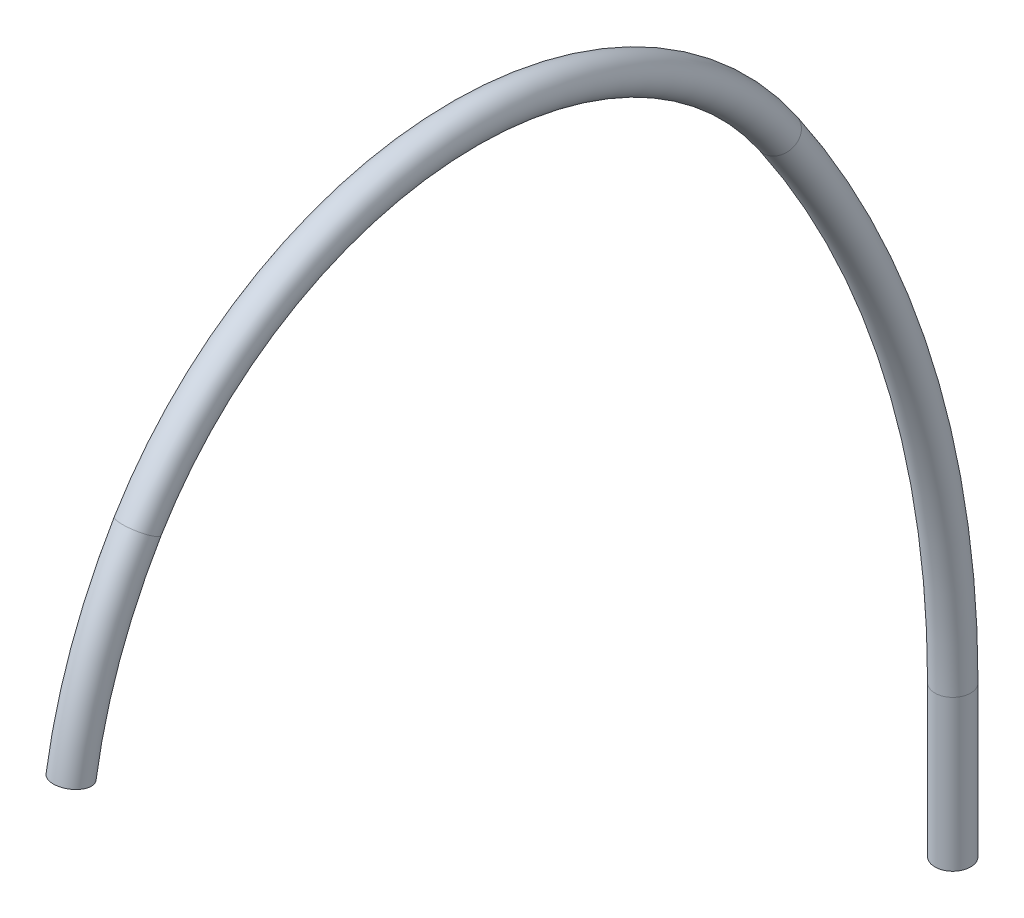
ISO-10303-21;
HEADER;
FILE_DESCRIPTION(('STEP AP214'),'2;1');
FILE_NAME('part.step','',(''),(''),'','','');
FILE_SCHEMA(('AUTOMOTIVE_DESIGN { 1 0 10303 214 1 1 1 1 }'));
ENDSEC;
DATA;
#1=APPLICATION_CONTEXT('core data for automotive mechanical design processes');
#2=APPLICATION_PROTOCOL_DEFINITION('international standard','automotive_design',2000,#1);
#3=PRODUCT_CONTEXT('',#1,'mechanical');
#4=PRODUCT('Part','Part','',(#3));
#5=PRODUCT_RELATED_PRODUCT_CATEGORY('part','',(#4));
#6=PRODUCT_DEFINITION_FORMATION('','',#4);
#7=PRODUCT_DEFINITION_CONTEXT('part definition',#1,'design');
#8=PRODUCT_DEFINITION('design','',#6,#7);
#9=PRODUCT_DEFINITION_SHAPE('','',#8);
#10=(LENGTH_UNIT() NAMED_UNIT(*) SI_UNIT(.MILLI.,.METRE.));
#11=(NAMED_UNIT(*) PLANE_ANGLE_UNIT() SI_UNIT($,.RADIAN.));
#12=(NAMED_UNIT(*) SI_UNIT($,.STERADIAN.) SOLID_ANGLE_UNIT());
#13=UNCERTAINTY_MEASURE_WITH_UNIT(LENGTH_MEASURE(1.E-05),#10,'distance_accuracy_value','');
#14=(GEOMETRIC_REPRESENTATION_CONTEXT(3) GLOBAL_UNCERTAINTY_ASSIGNED_CONTEXT((#13)) GLOBAL_UNIT_ASSIGNED_CONTEXT((#10,
#11,#12)) REPRESENTATION_CONTEXT('',''));
#15=CARTESIAN_POINT('',(0.,0.,0.));
#16=DIRECTION('',(0.,0.,1.));
#17=DIRECTION('',(1.,0.,0.));
#18=AXIS2_PLACEMENT_3D('',#15,#16,#17);
#19=CARTESIAN_POINT('',(0.,160.614265839188,117.12690278007));
#20=DIRECTION('',(1.,0.,0.));
#21=DIRECTION('',(0.,0.,-1.));
#22=AXIS2_PLACEMENT_3D('',#19,#20,#21);
#23=TOROIDAL_SURFACE('',#22,143.708020588454,5.);
#24=CARTESIAN_POINT('',(0.,234.429806703849,240.428407670761));
#25=DIRECTION('',(0.,-0.858000161617963,0.51364941610358));
#26=DIRECTION('',(0.,-0.51364941610358,-0.858000161617963));
#27=AXIS2_PLACEMENT_3D('',#24,#25,#26);
#28=CIRCLE('',#27,5.);
#29=CARTESIAN_POINT('',(0.,236.998053784367,244.718408478851));
#30=VERTEX_POINT('',#29);
#31=EDGE_CURVE('E37',#30,#30,#28,.T.);
#32=CARTESIAN_POINT('',(0.,182.868001968919,259.101430107052));
#33=DIRECTION('',(0.,-0.987937393790729,0.154853821231454));
#34=DIRECTION('',(0.,-0.154853821231454,-0.987937393790729));
#35=AXIS2_PLACEMENT_3D('',#32,#33,#34);
#36=CIRCLE('',#35,5.);
#37=CARTESIAN_POINT('',(0.,183.642271075076,264.041117076005));
#38=VERTEX_POINT('',#37);
#39=EDGE_CURVE('E10',#38,#38,#36,.T.);
#40=CARTESIAN_POINT('',(0.,160.614265839188,117.12690278007));
#41=DIRECTION('',(1.,0.,0.));
#42=DIRECTION('',(0.,0.,-1.));
#43=AXIS2_PLACEMENT_3D('',#40,#41,#42);
#44=CIRCLE('',#43,148.708020588454);
#45=EDGE_CURVE('',#30,#38,#44,.T.);
#46=ORIENTED_EDGE('',*,*,#31,.T.);
#47=ORIENTED_EDGE('',*,*,#39,.F.);
#48=ORIENTED_EDGE('',*,*,#45,.T.);
#49=ORIENTED_EDGE('',*,*,#45,.F.);
#50=EDGE_LOOP('',(#46,#48,#47,#49));
#51=FACE_BOUND('',#50,.T.);
#52=ADVANCED_FACE('F31',(#51),#23,.T.);
#53=CARTESIAN_POINT('',(0.,179.627389442073,148.886430996582));
#54=DIRECTION('',(1.,0.,0.));
#55=DIRECTION('',(0.,0.,-1.));
#56=AXIS2_PLACEMENT_3D('',#53,#54,#55);
#57=TOROIDAL_SURFACE('',#56,106.692260408849,5.);
#58=CARTESIAN_POINT('',(0.,239.966049995903,60.8950423626975));
#59=DIRECTION('',(0.,0.824721383694545,0.565539246451522));
#60=DIRECTION('',(0.,-0.565539246451522,0.824721383694545));
#61=AXIS2_PLACEMENT_3D('',#58,#59,#60);
#62=CIRCLE('',#61,5.);
#63=CARTESIAN_POINT('',(0.,242.79374622816,56.7714354442248));
#64=VERTEX_POINT('',#63);
#65=EDGE_CURVE('E41',#64,#64,#62,.T.);
#66=CARTESIAN_POINT('',(0.,179.627389442073,148.886430996582));
#67=DIRECTION('',(1.,0.,0.));
#68=DIRECTION('',(0.,0.,-1.));
#69=AXIS2_PLACEMENT_3D('',#66,#67,#68);
#70=CIRCLE('',#69,111.692260408849);
#71=EDGE_CURVE('',#64,#30,#70,.T.);
#72=ORIENTED_EDGE('',*,*,#65,.T.);
#73=ORIENTED_EDGE('',*,*,#31,.F.);
#74=ORIENTED_EDGE('',*,*,#71,.T.);
#75=ORIENTED_EDGE('',*,*,#71,.F.);
#76=EDGE_LOOP('',(#72,#74,#73,#75));
#77=FACE_BOUND('',#76,.T.);
#78=ADVANCED_FACE('F93',(#77),#57,.T.);
#79=CARTESIAN_POINT('',(0.,82.2054172623216,290.956117941329));
#80=DIRECTION('',(1.,0.,0.));
#81=DIRECTION('',(0.,0.,-1.));
#82=AXIS2_PLACEMENT_3D('',#79,#80,#81);
#83=TOROIDAL_SURFACE('',#82,278.956117941329,5.);
#84=CARTESIAN_POINT('',(0.,82.2054172623216,12.));
#85=DIRECTION('',(0.,1.,0.));
#86=DIRECTION('',(0.,0.,1.));
#87=AXIS2_PLACEMENT_3D('',#84,#85,#86);
#88=CIRCLE('',#87,5.);
#89=CARTESIAN_POINT('',(0.,82.2054172623216,7.00000000000001));
#90=VERTEX_POINT('',#89);
#91=EDGE_CURVE('E45',#90,#90,#88,.T.);
#92=CARTESIAN_POINT('',(0.,82.2054172623216,290.956117941329));
#93=DIRECTION('',(1.,0.,0.));
#94=DIRECTION('',(0.,0.,-1.));
#95=AXIS2_PLACEMENT_3D('',#92,#93,#94);
#96=CIRCLE('',#95,283.956117941329);
#97=EDGE_CURVE('',#90,#64,#96,.T.);
#98=ORIENTED_EDGE('',*,*,#91,.T.);
#99=ORIENTED_EDGE('',*,*,#65,.F.);
#100=ORIENTED_EDGE('',*,*,#97,.T.);
#101=ORIENTED_EDGE('',*,*,#97,.F.);
#102=EDGE_LOOP('',(#98,#100,#99,#101));
#103=FACE_BOUND('',#102,.T.);
#104=ADVANCED_FACE('F88',(#103),#83,.T.);
#105=CARTESIAN_POINT('',(0.,82.2054172623216,12.));
#106=DIRECTION('',(0.,-1.,0.));
#107=DIRECTION('',(0.,0.,-1.));
#108=AXIS2_PLACEMENT_3D('',#105,#106,#107);
#109=CYLINDRICAL_SURFACE('',#108,5.);
#110=ORIENTED_EDGE('',*,*,#91,.F.);
#111=EDGE_LOOP('',(#110));
#112=FACE_BOUND('',#111,.T.);
#113=CARTESIAN_POINT('',(0.,40.,12.));
#114=DIRECTION('',(0.,1.,0.));
#115=DIRECTION('',(0.,0.,1.));
#116=AXIS2_PLACEMENT_3D('',#113,#114,#115);
#117=CIRCLE('',#116,5.);
#118=CARTESIAN_POINT('',(0.,40.,17.));
#119=VERTEX_POINT('',#118);
#120=EDGE_CURVE('E48',#119,#119,#117,.T.);
#121=ORIENTED_EDGE('',*,*,#120,.T.);
#122=EDGE_LOOP('',(#121));
#123=FACE_BOUND('',#122,.T.);
#124=ADVANCED_FACE('F80',(#112,#123),#109,.T.);
#125=CARTESIAN_POINT('',(0.,182.868001968919,259.101430107052));
#126=DIRECTION('',(0.,-0.987937393790729,0.154853821231454));
#127=DIRECTION('',(0.,-0.154853821231454,-0.987937393790729));
#128=AXIS2_PLACEMENT_3D('',#125,#126,#127);
#129=PLANE('',#128);
#130=CARTESIAN_POINT('',(0.,182.868001968918,259.101430107052));
#131=DIRECTION('',(0.,-0.987937393790729,0.154853821231454));
#132=DIRECTION('',(0.,-0.154853821231454,-0.987937393790729));
#133=AXIS2_PLACEMENT_3D('',#130,#131,#132);
#134=CIRCLE('',#133,4.);
#135=CARTESIAN_POINT('',(0.,183.487417253844,263.053179682215));
#136=VERTEX_POINT('',#135);
#137=EDGE_CURVE('E51',#136,#136,#134,.T.);
#138=ORIENTED_EDGE('',*,*,#137,.F.);
#139=EDGE_LOOP('',(#138));
#140=FACE_BOUND('',#139,.T.);
#141=ORIENTED_EDGE('',*,*,#39,.T.);
#142=EDGE_LOOP('',(#141));
#143=FACE_BOUND('',#142,.T.);
#144=ADVANCED_FACE('F78',(#140,#143),#129,.T.);
#145=CARTESIAN_POINT('',(0.,40.,12.));
#146=DIRECTION('',(0.,1.,0.));
#147=DIRECTION('',(0.,0.,1.));
#148=AXIS2_PLACEMENT_3D('',#145,#146,#147);
#149=PLANE('',#148);
#150=CARTESIAN_POINT('',(0.,40.,12.));
#151=DIRECTION('',(0.,1.,0.));
#152=DIRECTION('',(0.,0.,1.));
#153=AXIS2_PLACEMENT_3D('',#150,#151,#152);
#154=CIRCLE('',#153,4.);
#155=CARTESIAN_POINT('',(0.,40.,16.));
#156=VERTEX_POINT('',#155);
#157=EDGE_CURVE('E54',#156,#156,#154,.T.);
#158=ORIENTED_EDGE('',*,*,#157,.T.);
#159=EDGE_LOOP('',(#158));
#160=FACE_BOUND('',#159,.T.);
#161=ORIENTED_EDGE('',*,*,#120,.F.);
#162=EDGE_LOOP('',(#161));
#163=FACE_BOUND('',#162,.T.);
#164=ADVANCED_FACE('F74',(#160,#163),#149,.F.);
#165=CARTESIAN_POINT('',(0.,160.614265839188,117.12690278007));
#166=DIRECTION('',(1.,0.,0.));
#167=DIRECTION('',(0.,0.,-1.));
#168=AXIS2_PLACEMENT_3D('',#165,#166,#167);
#169=TOROIDAL_SURFACE('',#168,143.708020588454,4.);
#170=CARTESIAN_POINT('',(0.,234.429806703849,240.428407670761));
#171=DIRECTION('',(0.,0.858000161617961,-0.513649416103584));
#172=DIRECTION('',(0.,0.513649416103584,0.858000161617961));
#173=AXIS2_PLACEMENT_3D('',#170,#171,#172);
#174=CIRCLE('',#173,4.);
#175=CARTESIAN_POINT('',(0.,236.484404368264,243.860408317233));
#176=VERTEX_POINT('',#175);
#177=EDGE_CURVE('E60',#176,#176,#174,.F.);
#178=CARTESIAN_POINT('',(0.,160.614265839188,117.12690278007));
#179=DIRECTION('',(1.,0.,0.));
#180=DIRECTION('',(0.,0.,-1.));
#181=AXIS2_PLACEMENT_3D('',#178,#179,#180);
#182=CIRCLE('',#181,147.708020588454);
#183=EDGE_CURVE('',#176,#136,#182,.T.);
#184=ORIENTED_EDGE('',*,*,#177,.F.);
#185=ORIENTED_EDGE('',*,*,#137,.T.);
#186=ORIENTED_EDGE('',*,*,#183,.T.);
#187=ORIENTED_EDGE('',*,*,#183,.F.);
#188=EDGE_LOOP('',(#184,#186,#185,#187));
#189=FACE_BOUND('',#188,.T.);
#190=ADVANCED_FACE('F71',(#189),#169,.F.);
#191=CARTESIAN_POINT('',(0.,179.627389442073,148.886430996582));
#192=DIRECTION('',(1.,0.,0.));
#193=DIRECTION('',(0.,0.,-1.));
#194=AXIS2_PLACEMENT_3D('',#191,#192,#193);
#195=TOROIDAL_SURFACE('',#194,106.692260408849,4.);
#196=CARTESIAN_POINT('',(0.,239.966049995903,60.8950423626975));
#197=DIRECTION('',(0.,-0.824721383694545,-0.565539246451522));
#198=DIRECTION('',(0.,0.565539246451522,-0.824721383694545));
#199=AXIS2_PLACEMENT_3D('',#196,#197,#198);
#200=CIRCLE('',#199,4.);
#201=CARTESIAN_POINT('',(0.,242.228206981709,57.5961568279193));
#202=VERTEX_POINT('',#201);
#203=EDGE_CURVE('E63',#202,#202,#200,.F.);
#204=CARTESIAN_POINT('',(0.,179.627389442073,148.886430996582));
#205=DIRECTION('',(1.,0.,0.));
#206=DIRECTION('',(0.,0.,-1.));
#207=AXIS2_PLACEMENT_3D('',#204,#205,#206);
#208=CIRCLE('',#207,110.692260408849);
#209=EDGE_CURVE('',#202,#176,#208,.T.);
#210=ORIENTED_EDGE('',*,*,#203,.F.);
#211=ORIENTED_EDGE('',*,*,#177,.T.);
#212=ORIENTED_EDGE('',*,*,#209,.T.);
#213=ORIENTED_EDGE('',*,*,#209,.F.);
#214=EDGE_LOOP('',(#210,#212,#211,#213));
#215=FACE_BOUND('',#214,.T.);
#216=ADVANCED_FACE('F69',(#215),#195,.F.);
#217=CARTESIAN_POINT('',(0.,82.2054172623216,290.956117941329));
#218=DIRECTION('',(1.,0.,0.));
#219=DIRECTION('',(0.,0.,-1.));
#220=AXIS2_PLACEMENT_3D('',#217,#218,#219);
#221=TOROIDAL_SURFACE('',#220,278.956117941329,4.);
#222=CARTESIAN_POINT('',(0.,82.2054172623216,12.));
#223=DIRECTION('',(0.,-1.,0.));
#224=DIRECTION('',(0.,0.,-1.));
#225=AXIS2_PLACEMENT_3D('',#222,#223,#224);
#226=CIRCLE('',#225,4.);
#227=CARTESIAN_POINT('',(0.,82.2054172623216,8.00000000000001));
#228=VERTEX_POINT('',#227);
#229=EDGE_CURVE('E57',#228,#228,#226,.F.);
#230=CARTESIAN_POINT('',(0.,82.2054172623216,290.956117941329));
#231=DIRECTION('',(1.,0.,0.));
#232=DIRECTION('',(0.,0.,-1.));
#233=AXIS2_PLACEMENT_3D('',#230,#231,#232);
#234=CIRCLE('',#233,282.956117941329);
#235=EDGE_CURVE('',#228,#202,#234,.T.);
#236=ORIENTED_EDGE('',*,*,#229,.F.);
#237=ORIENTED_EDGE('',*,*,#203,.T.);
#238=ORIENTED_EDGE('',*,*,#235,.T.);
#239=ORIENTED_EDGE('',*,*,#235,.F.);
#240=EDGE_LOOP('',(#236,#238,#237,#239));
#241=FACE_BOUND('',#240,.T.);
#242=ADVANCED_FACE('F142',(#241),#221,.F.);
#243=CARTESIAN_POINT('',(0.,82.2054172623216,12.));
#244=DIRECTION('',(0.,-1.,0.));
#245=DIRECTION('',(0.,0.,-1.));
#246=AXIS2_PLACEMENT_3D('',#243,#244,#245);
#247=CYLINDRICAL_SURFACE('',#246,4.);
#248=ORIENTED_EDGE('',*,*,#229,.T.);
#249=EDGE_LOOP('',(#248));
#250=FACE_BOUND('',#249,.T.);
#251=ORIENTED_EDGE('',*,*,#157,.F.);
#252=EDGE_LOOP('',(#251));
#253=FACE_BOUND('',#252,.T.);
#254=ADVANCED_FACE('F152',(#250,#253),#247,.F.);
#255=CLOSED_SHELL('',(#52,#78,#104,#124,#144,#164,#190,#216,#242,#254));
#256=MANIFOLD_SOLID_BREP('B2',#255);
#257=ADVANCED_BREP_SHAPE_REPRESENTATION('',(#18,#256),#14);
#258=SHAPE_DEFINITION_REPRESENTATION(#9,#257);
ENDSEC;
END-ISO-10303-21;
